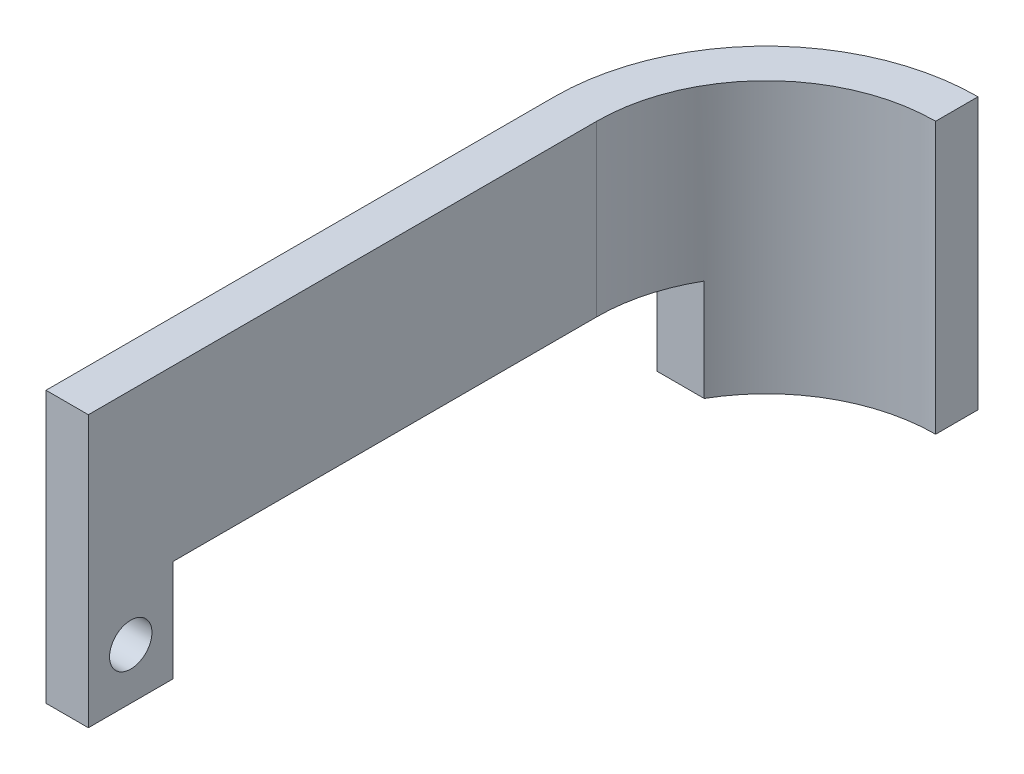
ISO-10303-21;
HEADER;
FILE_DESCRIPTION(('STEP AP214'),'2;1');
FILE_NAME('part.step','',(''),(''),'','','');
FILE_SCHEMA(('AUTOMOTIVE_DESIGN { 1 0 10303 214 1 1 1 1 }'));
ENDSEC;
DATA;
#1=APPLICATION_CONTEXT('core data for automotive mechanical design processes');
#2=APPLICATION_PROTOCOL_DEFINITION('international standard','automotive_design',2000,#1);
#3=PRODUCT_CONTEXT('',#1,'mechanical');
#4=PRODUCT('Part','Part','',(#3));
#5=PRODUCT_RELATED_PRODUCT_CATEGORY('part','',(#4));
#6=PRODUCT_DEFINITION_FORMATION('','',#4);
#7=PRODUCT_DEFINITION_CONTEXT('part definition',#1,'design');
#8=PRODUCT_DEFINITION('design','',#6,#7);
#9=PRODUCT_DEFINITION_SHAPE('','',#8);
#10=(LENGTH_UNIT() NAMED_UNIT(*) SI_UNIT(.MILLI.,.METRE.));
#11=(NAMED_UNIT(*) PLANE_ANGLE_UNIT() SI_UNIT($,.RADIAN.));
#12=(NAMED_UNIT(*) SI_UNIT($,.STERADIAN.) SOLID_ANGLE_UNIT());
#13=UNCERTAINTY_MEASURE_WITH_UNIT(LENGTH_MEASURE(1.E-05),#10,'distance_accuracy_value','');
#14=(GEOMETRIC_REPRESENTATION_CONTEXT(3) GLOBAL_UNCERTAINTY_ASSIGNED_CONTEXT((#13)) GLOBAL_UNIT_ASSIGNED_CONTEXT((#10,
#11,#12)) REPRESENTATION_CONTEXT('',''));
#15=CARTESIAN_POINT('',(0.,0.,0.));
#16=DIRECTION('',(0.,0.,1.));
#17=DIRECTION('',(1.,0.,0.));
#18=AXIS2_PLACEMENT_3D('',#15,#16,#17);
#19=CARTESIAN_POINT('',(0.,40.64,0.));
#20=DIRECTION('',(1.,0.,0.));
#21=DIRECTION('',(0.,0.,-1.));
#22=AXIS2_PLACEMENT_3D('',#19,#20,#21);
#23=PLANE('',#22);
#24=CARTESIAN_POINT('',(0.,7.62,-6.35));
#25=DIRECTION('',(1.,0.,0.));
#26=DIRECTION('',(0.,0.,-1.));
#27=AXIS2_PLACEMENT_3D('',#24,#25,#26);
#28=CIRCLE('',#27,3.175);
#29=CARTESIAN_POINT('',(0.,7.62,-9.525));
#30=VERTEX_POINT('',#29);
#31=EDGE_CURVE('E132',#30,#30,#28,.T.);
#32=ORIENTED_EDGE('',*,*,#31,.T.);
#33=EDGE_LOOP('',(#32));
#34=FACE_BOUND('',#33,.T.);
#35=DIRECTION('',(0.,-1.,0.));
#36=VECTOR('',#35,1.);
#37=CARTESIAN_POINT('',(0.,0.,-12.7));
#38=LINE('',#37,#36);
#39=CARTESIAN_POINT('',(0.,15.24,-12.7));
#40=VERTEX_POINT('',#39);
#41=CARTESIAN_POINT('',(0.,0.,-12.7));
#42=VERTEX_POINT('',#41);
#43=EDGE_CURVE('E163',#40,#42,#38,.T.);
#44=ORIENTED_EDGE('',*,*,#43,.T.);
#45=DIRECTION('',(0.,0.,1.));
#46=VECTOR('',#45,1.);
#47=CARTESIAN_POINT('',(0.,0.,0.));
#48=LINE('',#47,#46);
#49=CARTESIAN_POINT('',(0.,0.,0.));
#50=VERTEX_POINT('',#49);
#51=EDGE_CURVE('E129',#42,#50,#48,.T.);
#52=ORIENTED_EDGE('',*,*,#51,.T.);
#53=DIRECTION('',(0.,-1.,0.));
#54=VECTOR('',#53,1.);
#55=CARTESIAN_POINT('',(0.,40.64,0.));
#56=LINE('',#55,#54);
#57=CARTESIAN_POINT('',(0.,40.64,0.));
#58=VERTEX_POINT('',#57);
#59=EDGE_CURVE('E150',#58,#50,#56,.T.);
#60=ORIENTED_EDGE('',*,*,#59,.F.);
#61=DIRECTION('',(0.,0.,1.));
#62=VECTOR('',#61,1.);
#63=CARTESIAN_POINT('',(0.,40.64,0.));
#64=LINE('',#63,#62);
#65=CARTESIAN_POINT('',(0.,40.64,-76.2));
#66=VERTEX_POINT('',#65);
#67=EDGE_CURVE('E142',#66,#58,#64,.T.);
#68=ORIENTED_EDGE('',*,*,#67,.F.);
#69=DIRECTION('',(0.,-1.,0.));
#70=VECTOR('',#69,1.);
#71=CARTESIAN_POINT('',(0.,40.64,-76.2));
#72=LINE('',#71,#70);
#73=CARTESIAN_POINT('',(0.,15.24,-76.2));
#74=VERTEX_POINT('',#73);
#75=EDGE_CURVE('E125',#66,#74,#72,.T.);
#76=ORIENTED_EDGE('',*,*,#75,.T.);
#77=DIRECTION('',(0.,0.,1.));
#78=VECTOR('',#77,1.);
#79=CARTESIAN_POINT('',(0.,15.24,-12.7));
#80=LINE('',#79,#78);
#81=EDGE_CURVE('E176',#74,#40,#80,.T.);
#82=ORIENTED_EDGE('',*,*,#81,.T.);
#83=EDGE_LOOP('',(#44,#52,#60,#68,#76,#82));
#84=FACE_BOUND('',#83,.T.);
#85=ADVANCED_FACE('F41',(#34,#84),#23,.F.);
#86=CARTESIAN_POINT('',(6.35,40.64,0.));
#87=DIRECTION('',(-1.,0.,0.));
#88=DIRECTION('',(0.,0.,1.));
#89=AXIS2_PLACEMENT_3D('',#86,#87,#88);
#90=PLANE('',#89);
#91=CARTESIAN_POINT('',(6.35,7.62,-6.35));
#92=DIRECTION('',(1.,0.,0.));
#93=DIRECTION('',(0.,0.,-1.));
#94=AXIS2_PLACEMENT_3D('',#91,#92,#93);
#95=CIRCLE('',#94,3.175);
#96=CARTESIAN_POINT('',(6.35,7.62,-9.525));
#97=VERTEX_POINT('',#96);
#98=EDGE_CURVE('E187',#97,#97,#95,.T.);
#99=ORIENTED_EDGE('',*,*,#98,.F.);
#100=EDGE_LOOP('',(#99));
#101=FACE_BOUND('',#100,.T.);
#102=DIRECTION('',(0.,-1.,0.));
#103=VECTOR('',#102,1.);
#104=CARTESIAN_POINT('',(6.35,40.64,-12.7));
#105=LINE('',#104,#103);
#106=CARTESIAN_POINT('',(6.35,15.24,-12.7));
#107=VERTEX_POINT('',#106);
#108=CARTESIAN_POINT('',(6.35,0.,-12.7));
#109=VERTEX_POINT('',#108);
#110=EDGE_CURVE('E167',#107,#109,#105,.T.);
#111=ORIENTED_EDGE('',*,*,#110,.F.);
#112=DIRECTION('',(0.,0.,1.));
#113=VECTOR('',#112,1.);
#114=CARTESIAN_POINT('',(6.35,15.24,0.));
#115=LINE('',#114,#113);
#116=CARTESIAN_POINT('',(6.35,15.24,-76.2));
#117=VERTEX_POINT('',#116);
#118=EDGE_CURVE('E190',#117,#107,#115,.T.);
#119=ORIENTED_EDGE('',*,*,#118,.F.);
#120=DIRECTION('',(0.,-1.,0.));
#121=VECTOR('',#120,1.);
#122=CARTESIAN_POINT('',(6.35,40.64,-76.2));
#123=LINE('',#122,#121);
#124=CARTESIAN_POINT('',(6.35,40.64,-76.2));
#125=VERTEX_POINT('',#124);
#126=EDGE_CURVE('E120',#125,#117,#123,.T.);
#127=ORIENTED_EDGE('',*,*,#126,.F.);
#128=DIRECTION('',(0.,0.,-1.));
#129=VECTOR('',#128,1.);
#130=CARTESIAN_POINT('',(6.35,40.64,0.));
#131=LINE('',#130,#129);
#132=CARTESIAN_POINT('',(6.35,40.64,0.));
#133=VERTEX_POINT('',#132);
#134=EDGE_CURVE('E110',#133,#125,#131,.T.);
#135=ORIENTED_EDGE('',*,*,#134,.F.);
#136=DIRECTION('',(0.,-1.,0.));
#137=VECTOR('',#136,1.);
#138=CARTESIAN_POINT('',(6.35,40.64,0.));
#139=LINE('',#138,#137);
#140=CARTESIAN_POINT('',(6.35,0.,0.));
#141=VERTEX_POINT('',#140);
#142=EDGE_CURVE('E147',#133,#141,#139,.T.);
#143=ORIENTED_EDGE('',*,*,#142,.T.);
#144=DIRECTION('',(0.,0.,-1.));
#145=VECTOR('',#144,1.);
#146=CARTESIAN_POINT('',(6.35,0.,0.));
#147=LINE('',#146,#145);
#148=EDGE_CURVE('E134',#141,#109,#147,.T.);
#149=ORIENTED_EDGE('',*,*,#148,.T.);
#150=EDGE_LOOP('',(#111,#119,#127,#135,#143,#149));
#151=FACE_BOUND('',#150,.T.);
#152=ADVANCED_FACE('F213',(#101,#151),#90,.F.);
#153=CARTESIAN_POINT('',(31.75,40.64,-76.2));
#154=DIRECTION('',(0.,-1.,0.));
#155=DIRECTION('',(0.,0.,-1.));
#156=AXIS2_PLACEMENT_3D('',#153,#154,#155);
#157=CYLINDRICAL_SURFACE('',#156,25.4);
#158=DIRECTION('',(0.,-1.,0.));
#159=VECTOR('',#158,1.);
#160=CARTESIAN_POINT('',(9.75295474387526,40.64,-88.9));
#161=LINE('',#160,#159);
#162=CARTESIAN_POINT('',(9.75295474387526,0.,-88.9));
#163=VERTEX_POINT('',#162);
#164=CARTESIAN_POINT('',(9.75295474387526,15.24,-88.9));
#165=VERTEX_POINT('',#164);
#166=EDGE_CURVE('E197',#163,#165,#161,.F.);
#167=ORIENTED_EDGE('',*,*,#166,.F.);
#168=CARTESIAN_POINT('',(31.75,0.,-76.2));
#169=DIRECTION('',(0.,-1.,0.));
#170=DIRECTION('',(0.,0.,1.));
#171=AXIS2_PLACEMENT_3D('',#168,#169,#170);
#172=CIRCLE('',#171,25.4);
#173=CARTESIAN_POINT('',(31.75,0.,-101.6));
#174=VERTEX_POINT('',#173);
#175=EDGE_CURVE('E119',#163,#174,#172,.T.);
#176=ORIENTED_EDGE('',*,*,#175,.T.);
#177=DIRECTION('',(0.,-1.,0.));
#178=VECTOR('',#177,1.);
#179=CARTESIAN_POINT('',(31.75,40.64,-101.6));
#180=LINE('',#179,#178);
#181=CARTESIAN_POINT('',(31.75,40.64,-101.6));
#182=VERTEX_POINT('',#181);
#183=EDGE_CURVE('E115',#182,#174,#180,.T.);
#184=ORIENTED_EDGE('',*,*,#183,.F.);
#185=CARTESIAN_POINT('',(31.75,40.64,-76.2));
#186=DIRECTION('',(0.,-1.,0.));
#187=DIRECTION('',(0.,0.,1.));
#188=AXIS2_PLACEMENT_3D('',#185,#186,#187);
#189=CIRCLE('',#188,25.4);
#190=EDGE_CURVE('E104',#125,#182,#189,.T.);
#191=ORIENTED_EDGE('',*,*,#190,.F.);
#192=ORIENTED_EDGE('',*,*,#126,.T.);
#193=CARTESIAN_POINT('',(31.75,15.24,-76.2));
#194=DIRECTION('',(0.,-1.,0.));
#195=DIRECTION('',(0.,0.,-1.));
#196=AXIS2_PLACEMENT_3D('',#193,#194,#195);
#197=CIRCLE('',#196,25.4);
#198=EDGE_CURVE('E193',#165,#117,#197,.F.);
#199=ORIENTED_EDGE('',*,*,#198,.F.);
#200=EDGE_LOOP('',(#167,#176,#184,#191,#192,#199));
#201=FACE_BOUND('',#200,.T.);
#202=ADVANCED_FACE('F117',(#201),#157,.F.);
#203=CARTESIAN_POINT('',(31.75,40.64,-76.2));
#204=DIRECTION('',(0.,-1.,0.));
#205=DIRECTION('',(0.,0.,-1.));
#206=AXIS2_PLACEMENT_3D('',#203,#204,#205);
#207=CYLINDRICAL_SURFACE('',#206,31.75);
#208=DIRECTION('',(0.,-1.,0.));
#209=VECTOR('',#208,1.);
#210=CARTESIAN_POINT('',(2.65064433703042,40.64,-88.9));
#211=LINE('',#210,#209);
#212=CARTESIAN_POINT('',(2.65064433703042,15.24,-88.9));
#213=VERTEX_POINT('',#212);
#214=CARTESIAN_POINT('',(2.65064433703042,0.,-88.9));
#215=VERTEX_POINT('',#214);
#216=EDGE_CURVE('E55',#213,#215,#211,.T.);
#217=ORIENTED_EDGE('',*,*,#216,.F.);
#218=CARTESIAN_POINT('',(31.75,15.24,-76.2));
#219=DIRECTION('',(0.,-1.,0.));
#220=DIRECTION('',(0.,0.,-1.));
#221=AXIS2_PLACEMENT_3D('',#218,#219,#220);
#222=CIRCLE('',#221,31.75);
#223=EDGE_CURVE('E11',#74,#213,#222,.T.);
#224=ORIENTED_EDGE('',*,*,#223,.F.);
#225=ORIENTED_EDGE('',*,*,#75,.F.);
#226=CARTESIAN_POINT('',(31.75,40.64,-76.2));
#227=DIRECTION('',(0.,1.,0.));
#228=DIRECTION('',(0.,0.,1.));
#229=AXIS2_PLACEMENT_3D('',#226,#227,#228);
#230=CIRCLE('',#229,31.75);
#231=CARTESIAN_POINT('',(31.75,40.64,-107.95));
#232=VERTEX_POINT('',#231);
#233=EDGE_CURVE('E64',#232,#66,#230,.T.);
#234=ORIENTED_EDGE('',*,*,#233,.F.);
#235=DIRECTION('',(0.,-1.,0.));
#236=VECTOR('',#235,1.);
#237=CARTESIAN_POINT('',(31.75,40.64,-107.95));
#238=LINE('',#237,#236);
#239=CARTESIAN_POINT('',(31.75,0.,-107.95));
#240=VERTEX_POINT('',#239);
#241=EDGE_CURVE('E121',#232,#240,#238,.T.);
#242=ORIENTED_EDGE('',*,*,#241,.T.);
#243=CARTESIAN_POINT('',(31.75,0.,-76.2));
#244=DIRECTION('',(0.,1.,0.));
#245=DIRECTION('',(0.,0.,1.));
#246=AXIS2_PLACEMENT_3D('',#243,#244,#245);
#247=CIRCLE('',#246,31.75);
#248=EDGE_CURVE('E139',#240,#215,#247,.T.);
#249=ORIENTED_EDGE('',*,*,#248,.T.);
#250=EDGE_LOOP('',(#217,#224,#225,#234,#242,#249));
#251=FACE_BOUND('',#250,.T.);
#252=ADVANCED_FACE('F226',(#251),#207,.T.);
#253=CARTESIAN_POINT('',(31.75,0.,-76.2));
#254=DIRECTION('',(0.,1.,0.));
#255=DIRECTION('',(0.,0.,1.));
#256=AXIS2_PLACEMENT_3D('',#253,#254,#255);
#257=PLANE('',#256);
#258=DIRECTION('',(-1.,0.,0.));
#259=VECTOR('',#258,1.);
#260=CARTESIAN_POINT('',(31.75,0.,-12.7));
#261=LINE('',#260,#259);
#262=EDGE_CURVE('E48',#109,#42,#261,.T.);
#263=ORIENTED_EDGE('',*,*,#262,.F.);
#264=ORIENTED_EDGE('',*,*,#148,.F.);
#265=DIRECTION('',(1.,0.,0.));
#266=VECTOR('',#265,1.);
#267=CARTESIAN_POINT('',(0.,0.,0.));
#268=LINE('',#267,#266);
#269=EDGE_CURVE('E131',#50,#141,#268,.T.);
#270=ORIENTED_EDGE('',*,*,#269,.F.);
#271=ORIENTED_EDGE('',*,*,#51,.F.);
#272=EDGE_LOOP('',(#263,#264,#270,#271));
#273=FACE_BOUND('',#272,.T.);
#274=ADVANCED_FACE('F178',(#273),#257,.F.);
#275=DIRECTION('',(1.,0.,0.));
#276=VECTOR('',#275,1.);
#277=CARTESIAN_POINT('',(31.75,0.,-88.9));
#278=LINE('',#277,#276);
#279=EDGE_CURVE('E152',#215,#163,#278,.T.);
#280=ORIENTED_EDGE('',*,*,#279,.F.);
#281=ORIENTED_EDGE('',*,*,#248,.F.);
#282=DIRECTION('',(0.,0.,-1.));
#283=VECTOR('',#282,1.);
#284=CARTESIAN_POINT('',(31.75,0.,-101.6));
#285=LINE('',#284,#283);
#286=EDGE_CURVE('E86',#174,#240,#285,.T.);
#287=ORIENTED_EDGE('',*,*,#286,.F.);
#288=ORIENTED_EDGE('',*,*,#175,.F.);
#289=EDGE_LOOP('',(#280,#281,#287,#288));
#290=FACE_BOUND('',#289,.T.);
#291=ADVANCED_FACE('F229',(#290),#257,.F.);
#292=CARTESIAN_POINT('',(0.,40.64,0.));
#293=DIRECTION('',(0.,0.,-1.));
#294=DIRECTION('',(-1.,0.,0.));
#295=AXIS2_PLACEMENT_3D('',#292,#293,#294);
#296=PLANE('',#295);
#297=ORIENTED_EDGE('',*,*,#269,.T.);
#298=ORIENTED_EDGE('',*,*,#142,.F.);
#299=DIRECTION('',(1.,0.,0.));
#300=VECTOR('',#299,1.);
#301=CARTESIAN_POINT('',(0.,40.64,0.));
#302=LINE('',#301,#300);
#303=EDGE_CURVE('E95',#58,#133,#302,.T.);
#304=ORIENTED_EDGE('',*,*,#303,.F.);
#305=ORIENTED_EDGE('',*,*,#59,.T.);
#306=EDGE_LOOP('',(#297,#298,#304,#305));
#307=FACE_BOUND('',#306,.T.);
#308=ADVANCED_FACE('F179',(#307),#296,.F.);
#309=CARTESIAN_POINT('',(31.75,40.64,-101.6));
#310=DIRECTION('',(-1.,0.,0.));
#311=DIRECTION('',(0.,0.,1.));
#312=AXIS2_PLACEMENT_3D('',#309,#310,#311);
#313=PLANE('',#312);
#314=ORIENTED_EDGE('',*,*,#286,.T.);
#315=ORIENTED_EDGE('',*,*,#241,.F.);
#316=DIRECTION('',(0.,0.,-1.));
#317=VECTOR('',#316,1.);
#318=CARTESIAN_POINT('',(31.75,40.64,-101.6));
#319=LINE('',#318,#317);
#320=EDGE_CURVE('E108',#182,#232,#319,.T.);
#321=ORIENTED_EDGE('',*,*,#320,.F.);
#322=ORIENTED_EDGE('',*,*,#183,.T.);
#323=EDGE_LOOP('',(#314,#315,#321,#322));
#324=FACE_BOUND('',#323,.T.);
#325=ADVANCED_FACE('F123',(#324),#313,.F.);
#326=CARTESIAN_POINT('',(31.75,40.64,-76.2));
#327=DIRECTION('',(0.,1.,0.));
#328=DIRECTION('',(0.,0.,1.));
#329=AXIS2_PLACEMENT_3D('',#326,#327,#328);
#330=PLANE('',#329);
#331=ORIENTED_EDGE('',*,*,#67,.T.);
#332=ORIENTED_EDGE('',*,*,#303,.T.);
#333=ORIENTED_EDGE('',*,*,#134,.T.);
#334=ORIENTED_EDGE('',*,*,#190,.T.);
#335=ORIENTED_EDGE('',*,*,#320,.T.);
#336=ORIENTED_EDGE('',*,*,#233,.T.);
#337=EDGE_LOOP('',(#331,#332,#333,#334,#335,#336));
#338=FACE_BOUND('',#337,.T.);
#339=ADVANCED_FACE('F106',(#338),#330,.T.);
#340=CARTESIAN_POINT('',(-34.29,7.62,-6.35));
#341=DIRECTION('',(1.,0.,0.));
#342=DIRECTION('',(0.,0.,-1.));
#343=AXIS2_PLACEMENT_3D('',#340,#341,#342);
#344=CYLINDRICAL_SURFACE('',#343,3.175);
#345=ORIENTED_EDGE('',*,*,#98,.T.);
#346=EDGE_LOOP('',(#345));
#347=FACE_BOUND('',#346,.T.);
#348=ORIENTED_EDGE('',*,*,#31,.F.);
#349=EDGE_LOOP('',(#348));
#350=FACE_BOUND('',#349,.T.);
#351=ADVANCED_FACE('F249',(#347,#350),#344,.F.);
#352=CARTESIAN_POINT('',(40.64,15.24,-12.7));
#353=DIRECTION('',(0.,-1.,0.));
#354=DIRECTION('',(0.,0.,-1.));
#355=AXIS2_PLACEMENT_3D('',#352,#353,#354);
#356=PLANE('',#355);
#357=ORIENTED_EDGE('',*,*,#118,.T.);
#358=DIRECTION('',(-1.,0.,0.));
#359=VECTOR('',#358,1.);
#360=CARTESIAN_POINT('',(40.64,15.24,-12.7));
#361=LINE('',#360,#359);
#362=EDGE_CURVE('E203',#107,#40,#361,.T.);
#363=ORIENTED_EDGE('',*,*,#362,.T.);
#364=ORIENTED_EDGE('',*,*,#81,.F.);
#365=ORIENTED_EDGE('',*,*,#223,.T.);
#366=DIRECTION('',(-1.,0.,0.));
#367=VECTOR('',#366,1.);
#368=CARTESIAN_POINT('',(40.64,15.24,-88.9));
#369=LINE('',#368,#367);
#370=EDGE_CURVE('E201',#165,#213,#369,.T.);
#371=ORIENTED_EDGE('',*,*,#370,.F.);
#372=ORIENTED_EDGE('',*,*,#198,.T.);
#373=EDGE_LOOP('',(#357,#363,#364,#365,#371,#372));
#374=FACE_BOUND('',#373,.T.);
#375=ADVANCED_FACE('F207',(#374),#356,.T.);
#376=CARTESIAN_POINT('',(40.64,0.,-12.7));
#377=DIRECTION('',(0.,0.,-1.));
#378=DIRECTION('',(0.,1.,0.));
#379=AXIS2_PLACEMENT_3D('',#376,#377,#378);
#380=PLANE('',#379);
#381=ORIENTED_EDGE('',*,*,#110,.T.);
#382=ORIENTED_EDGE('',*,*,#262,.T.);
#383=ORIENTED_EDGE('',*,*,#43,.F.);
#384=ORIENTED_EDGE('',*,*,#362,.F.);
#385=EDGE_LOOP('',(#381,#382,#383,#384));
#386=FACE_BOUND('',#385,.T.);
#387=ADVANCED_FACE('F160',(#386),#380,.T.);
#388=CARTESIAN_POINT('',(40.64,0.,-88.9));
#389=DIRECTION('',(0.,0.,1.));
#390=DIRECTION('',(1.,0.,0.));
#391=AXIS2_PLACEMENT_3D('',#388,#389,#390);
#392=PLANE('',#391);
#393=ORIENTED_EDGE('',*,*,#166,.T.);
#394=ORIENTED_EDGE('',*,*,#370,.T.);
#395=ORIENTED_EDGE('',*,*,#216,.T.);
#396=ORIENTED_EDGE('',*,*,#279,.T.);
#397=EDGE_LOOP('',(#393,#394,#395,#396));
#398=FACE_BOUND('',#397,.T.);
#399=ADVANCED_FACE('F223',(#398),#392,.T.);
#400=CLOSED_SHELL('',(#85,#152,#202,#252,#274,#291,#308,#325,#339,#351,#375,#387,#399));
#401=MANIFOLD_SOLID_BREP('B2',#400);
#402=ADVANCED_BREP_SHAPE_REPRESENTATION('',(#18,#401),#14);
#403=SHAPE_DEFINITION_REPRESENTATION(#9,#402);
ENDSEC;
END-ISO-10303-21;
